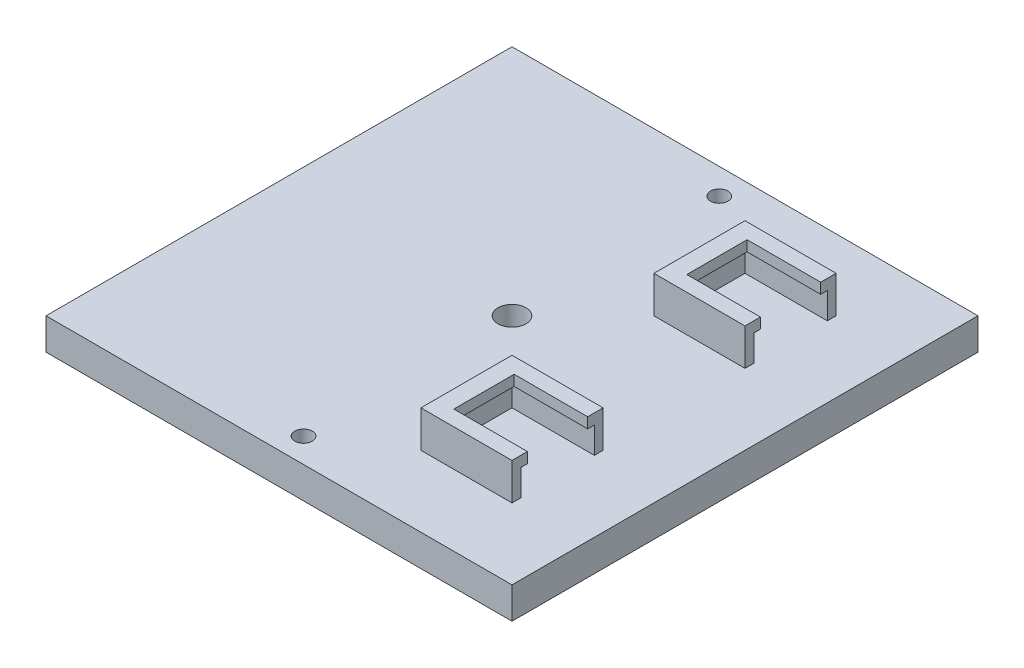
ISO-10303-21;
HEADER;
FILE_DESCRIPTION(('STEP AP214'),'2;1');
FILE_NAME('part.step','',(''),(''),'','','');
FILE_SCHEMA(('AUTOMOTIVE_DESIGN { 1 0 10303 214 1 1 1 1 }'));
ENDSEC;
DATA;
#1=APPLICATION_CONTEXT('core data for automotive mechanical design processes');
#2=APPLICATION_PROTOCOL_DEFINITION('international standard','automotive_design',2000,#1);
#3=PRODUCT_CONTEXT('',#1,'mechanical');
#4=PRODUCT('Part','Part','',(#3));
#5=PRODUCT_RELATED_PRODUCT_CATEGORY('part','',(#4));
#6=PRODUCT_DEFINITION_FORMATION('','',#4);
#7=PRODUCT_DEFINITION_CONTEXT('part definition',#1,'design');
#8=PRODUCT_DEFINITION('design','',#6,#7);
#9=PRODUCT_DEFINITION_SHAPE('','',#8);
#10=(LENGTH_UNIT() NAMED_UNIT(*) SI_UNIT(.MILLI.,.METRE.));
#11=(NAMED_UNIT(*) PLANE_ANGLE_UNIT() SI_UNIT($,.RADIAN.));
#12=(NAMED_UNIT(*) SI_UNIT($,.STERADIAN.) SOLID_ANGLE_UNIT());
#13=UNCERTAINTY_MEASURE_WITH_UNIT(LENGTH_MEASURE(1.E-05),#10,'distance_accuracy_value','');
#14=(GEOMETRIC_REPRESENTATION_CONTEXT(3) GLOBAL_UNCERTAINTY_ASSIGNED_CONTEXT((#13)) GLOBAL_UNIT_ASSIGNED_CONTEXT((#10,
#11,#12)) REPRESENTATION_CONTEXT('',''));
#15=CARTESIAN_POINT('',(0.,0.,0.));
#16=DIRECTION('',(0.,0.,1.));
#17=DIRECTION('',(1.,0.,0.));
#18=AXIS2_PLACEMENT_3D('',#15,#16,#17);
#19=CARTESIAN_POINT('',(-66.5,136.,66.5));
#20=DIRECTION('',(0.,0.,-1.));
#21=DIRECTION('',(-1.,0.,0.));
#22=AXIS2_PLACEMENT_3D('',#19,#20,#21);
#23=PLANE('',#22);
#24=DIRECTION('',(1.,0.,0.));
#25=VECTOR('',#24,1.);
#26=CARTESIAN_POINT('',(-66.5,0.,66.5));
#27=LINE('',#26,#25);
#28=CARTESIAN_POINT('',(-66.5,0.,66.5));
#29=VERTEX_POINT('',#28);
#30=CARTESIAN_POINT('',(66.5,0.,66.5));
#31=VERTEX_POINT('',#30);
#32=EDGE_CURVE('E280',#29,#31,#27,.T.);
#33=ORIENTED_EDGE('',*,*,#32,.T.);
#34=DIRECTION('',(0.,-1.,0.));
#35=VECTOR('',#34,1.);
#36=CARTESIAN_POINT('',(66.5,136.,66.5));
#37=LINE('',#36,#35);
#38=CARTESIAN_POINT('',(66.5,9.,66.5));
#39=VERTEX_POINT('',#38);
#40=EDGE_CURVE('E278',#39,#31,#37,.T.);
#41=ORIENTED_EDGE('',*,*,#40,.F.);
#42=DIRECTION('',(1.,0.,0.));
#43=VECTOR('',#42,1.);
#44=CARTESIAN_POINT('',(0.,9.,66.5));
#45=LINE('',#44,#43);
#46=CARTESIAN_POINT('',(-66.5,9.00000000000001,66.5));
#47=VERTEX_POINT('',#46);
#48=EDGE_CURVE('E283',#47,#39,#45,.T.);
#49=ORIENTED_EDGE('',*,*,#48,.F.);
#50=DIRECTION('',(0.,-1.,0.));
#51=VECTOR('',#50,1.);
#52=CARTESIAN_POINT('',(-66.5,136.,66.5));
#53=LINE('',#52,#51);
#54=EDGE_CURVE('E846',#47,#29,#53,.T.);
#55=ORIENTED_EDGE('',*,*,#54,.T.);
#56=EDGE_LOOP('',(#33,#41,#49,#55));
#57=FACE_BOUND('',#56,.T.);
#58=ADVANCED_FACE('F35',(#57),#23,.F.);
#59=CARTESIAN_POINT('',(-66.5,136.,-66.5));
#60=DIRECTION('',(0.,0.,1.));
#61=DIRECTION('',(1.,0.,0.));
#62=AXIS2_PLACEMENT_3D('',#59,#60,#61);
#63=PLANE('',#62);
#64=DIRECTION('',(-1.,0.,0.));
#65=VECTOR('',#64,1.);
#66=CARTESIAN_POINT('',(-66.5,0.,-66.5));
#67=LINE('',#66,#65);
#68=CARTESIAN_POINT('',(66.5,0.,-66.5));
#69=VERTEX_POINT('',#68);
#70=CARTESIAN_POINT('',(-66.5,0.,-66.5));
#71=VERTEX_POINT('',#70);
#72=EDGE_CURVE('E257',#69,#71,#67,.T.);
#73=ORIENTED_EDGE('',*,*,#72,.T.);
#74=DIRECTION('',(0.,-1.,0.));
#75=VECTOR('',#74,1.);
#76=CARTESIAN_POINT('',(-66.5,136.,-66.5));
#77=LINE('',#76,#75);
#78=CARTESIAN_POINT('',(-66.5,9.,-66.5));
#79=VERTEX_POINT('',#78);
#80=EDGE_CURVE('E302',#79,#71,#77,.T.);
#81=ORIENTED_EDGE('',*,*,#80,.F.);
#82=DIRECTION('',(1.,0.,0.));
#83=VECTOR('',#82,1.);
#84=CARTESIAN_POINT('',(-66.5,9.00000000000001,-66.5));
#85=LINE('',#84,#83);
#86=CARTESIAN_POINT('',(66.5,9.,-66.5));
#87=VERTEX_POINT('',#86);
#88=EDGE_CURVE('E268',#79,#87,#85,.T.);
#89=ORIENTED_EDGE('',*,*,#88,.T.);
#90=DIRECTION('',(0.,-1.,0.));
#91=VECTOR('',#90,1.);
#92=CARTESIAN_POINT('',(66.5,136.,-66.5));
#93=LINE('',#92,#91);
#94=EDGE_CURVE('E262',#87,#69,#93,.T.);
#95=ORIENTED_EDGE('',*,*,#94,.T.);
#96=EDGE_LOOP('',(#73,#81,#89,#95));
#97=FACE_BOUND('',#96,.T.);
#98=ADVANCED_FACE('F466',(#97),#63,.F.);
#99=CARTESIAN_POINT('',(0.,0.,0.));
#100=DIRECTION('',(0.,-1.,0.));
#101=DIRECTION('',(0.,0.,-1.));
#102=AXIS2_PLACEMENT_3D('',#99,#100,#101);
#103=PLANE('',#102);
#104=CARTESIAN_POINT('',(0.,0.,0.));
#105=DIRECTION('',(0.,-1.,0.));
#106=DIRECTION('',(0.,0.,-1.));
#107=AXIS2_PLACEMENT_3D('',#104,#105,#106);
#108=CIRCLE('',#107,4.);
#109=CARTESIAN_POINT('',(0.,0.,-4.));
#110=VERTEX_POINT('',#109);
#111=EDGE_CURVE('E831',#110,#110,#108,.T.);
#112=ORIENTED_EDGE('',*,*,#111,.F.);
#113=EDGE_LOOP('',(#112));
#114=FACE_BOUND('',#113,.T.);
#115=DIRECTION('',(0.,0.,-1.));
#116=VECTOR('',#115,1.);
#117=CARTESIAN_POINT('',(66.5,0.,66.5));
#118=LINE('',#117,#116);
#119=EDGE_CURVE('E274',#31,#69,#118,.T.);
#120=ORIENTED_EDGE('',*,*,#119,.F.);
#121=ORIENTED_EDGE('',*,*,#32,.F.);
#122=DIRECTION('',(0.,0.,1.));
#123=VECTOR('',#122,1.);
#124=CARTESIAN_POINT('',(-66.5,0.,66.5));
#125=LINE('',#124,#123);
#126=EDGE_CURVE('E272',#71,#29,#125,.T.);
#127=ORIENTED_EDGE('',*,*,#126,.F.);
#128=ORIENTED_EDGE('',*,*,#72,.F.);
#129=EDGE_LOOP('',(#120,#121,#127,#128));
#130=FACE_BOUND('',#129,.T.);
#131=CARTESIAN_POINT('',(0.,0.,-59.1597976431427));
#132=DIRECTION('',(0.,1.,0.));
#133=DIRECTION('',(0.,0.,1.));
#134=AXIS2_PLACEMENT_3D('',#131,#132,#133);
#135=CIRCLE('',#134,2.5);
#136=CARTESIAN_POINT('',(0.,0.,-56.6597976431427));
#137=VERTEX_POINT('',#136);
#138=EDGE_CURVE('E39',#137,#137,#135,.F.);
#139=ORIENTED_EDGE('',*,*,#138,.F.);
#140=EDGE_LOOP('',(#139));
#141=FACE_BOUND('',#140,.T.);
#142=CARTESIAN_POINT('',(0.,0.,59.4994711224337));
#143=DIRECTION('',(0.,1.,0.));
#144=DIRECTION('',(0.,0.,1.));
#145=AXIS2_PLACEMENT_3D('',#142,#143,#144);
#146=CIRCLE('',#145,2.5);
#147=CARTESIAN_POINT('',(0.,0.,61.9994711224337));
#148=VERTEX_POINT('',#147);
#149=EDGE_CURVE('E838',#148,#148,#146,.F.);
#150=ORIENTED_EDGE('',*,*,#149,.F.);
#151=EDGE_LOOP('',(#150));
#152=FACE_BOUND('',#151,.T.);
#153=ADVANCED_FACE('F473',(#114,#130,#141,#152),#103,.T.);
#154=CARTESIAN_POINT('',(46.25,19.5,0.));
#155=DIRECTION('',(1.,0.,0.));
#156=DIRECTION('',(0.,0.,-1.));
#157=AXIS2_PLACEMENT_3D('',#154,#155,#156);
#158=PLANE('',#157);
#159=DIRECTION('',(0.,1.,0.));
#160=VECTOR('',#159,1.);
#161=CARTESIAN_POINT('',(46.25,19.5,24.65));
#162=LINE('',#161,#160);
#163=CARTESIAN_POINT('',(46.25,16.5,24.65));
#164=VERTEX_POINT('',#163);
#165=CARTESIAN_POINT('',(46.25,19.5,24.65));
#166=VERTEX_POINT('',#165);
#167=EDGE_CURVE('E97',#164,#166,#162,.T.);
#168=ORIENTED_EDGE('',*,*,#167,.F.);
#169=DIRECTION('',(0.,0.,-1.));
#170=VECTOR('',#169,1.);
#171=CARTESIAN_POINT('',(46.25,16.5,43.75));
#172=LINE('',#171,#170);
#173=CARTESIAN_POINT('',(46.25,16.5,22.75));
#174=VERTEX_POINT('',#173);
#175=EDGE_CURVE('E249',#164,#174,#172,.T.);
#176=ORIENTED_EDGE('',*,*,#175,.T.);
#177=DIRECTION('',(0.,-1.,0.));
#178=VECTOR('',#177,1.);
#179=CARTESIAN_POINT('',(46.25,19.5,22.75));
#180=LINE('',#179,#178);
#181=CARTESIAN_POINT('',(46.25,9.,22.75));
#182=VERTEX_POINT('',#181);
#183=EDGE_CURVE('E256',#174,#182,#180,.T.);
#184=ORIENTED_EDGE('',*,*,#183,.T.);
#185=DIRECTION('',(0.,0.,1.));
#186=VECTOR('',#185,1.);
#187=CARTESIAN_POINT('',(46.25,9.,0.));
#188=LINE('',#187,#186);
#189=CARTESIAN_POINT('',(46.25,9.,20.25));
#190=VERTEX_POINT('',#189);
#191=EDGE_CURVE('E317',#190,#182,#188,.T.);
#192=ORIENTED_EDGE('',*,*,#191,.F.);
#193=DIRECTION('',(0.,-1.,0.));
#194=VECTOR('',#193,1.);
#195=CARTESIAN_POINT('',(46.25,19.5,20.25));
#196=LINE('',#195,#194);
#197=CARTESIAN_POINT('',(46.25,19.5,20.25));
#198=VERTEX_POINT('',#197);
#199=EDGE_CURVE('E250',#198,#190,#196,.T.);
#200=ORIENTED_EDGE('',*,*,#199,.F.);
#201=DIRECTION('',(0.,0.,1.));
#202=VECTOR('',#201,1.);
#203=CARTESIAN_POINT('',(46.25,19.5,0.));
#204=LINE('',#203,#202);
#205=EDGE_CURVE('E260',#198,#166,#204,.T.);
#206=ORIENTED_EDGE('',*,*,#205,.T.);
#207=EDGE_LOOP('',(#168,#176,#184,#192,#200,#206));
#208=FACE_BOUND('',#207,.T.);
#209=ADVANCED_FACE('F427',(#208),#158,.T.);
#210=CARTESIAN_POINT('',(46.25,19.5,0.));
#211=DIRECTION('',(-1.,0.,0.));
#212=DIRECTION('',(0.,0.,1.));
#213=AXIS2_PLACEMENT_3D('',#210,#211,#212);
#214=PLANE('',#213);
#215=DIRECTION('',(0.,0.,-1.));
#216=VECTOR('',#215,1.);
#217=CARTESIAN_POINT('',(46.25,19.5,0.));
#218=LINE('',#217,#216);
#219=CARTESIAN_POINT('',(46.25,19.5,-41.85));
#220=VERTEX_POINT('',#219);
#221=CARTESIAN_POINT('',(46.25,19.5,-46.25));
#222=VERTEX_POINT('',#221);
#223=EDGE_CURVE('E348',#220,#222,#218,.T.);
#224=ORIENTED_EDGE('',*,*,#223,.F.);
#225=DIRECTION('',(0.,-1.,0.));
#226=VECTOR('',#225,1.);
#227=CARTESIAN_POINT('',(46.25,19.5,-41.85));
#228=LINE('',#227,#226);
#229=CARTESIAN_POINT('',(46.25,16.5,-41.85));
#230=VERTEX_POINT('',#229);
#231=EDGE_CURVE('E331',#220,#230,#228,.T.);
#232=ORIENTED_EDGE('',*,*,#231,.T.);
#233=DIRECTION('',(0.,0.,-1.));
#234=VECTOR('',#233,1.);
#235=CARTESIAN_POINT('',(46.25,16.5,-22.75));
#236=LINE('',#235,#234);
#237=CARTESIAN_POINT('',(46.25,16.5,-43.75));
#238=VERTEX_POINT('',#237);
#239=EDGE_CURVE('E335',#230,#238,#236,.T.);
#240=ORIENTED_EDGE('',*,*,#239,.T.);
#241=DIRECTION('',(0.,-1.,0.));
#242=VECTOR('',#241,1.);
#243=CARTESIAN_POINT('',(46.25,19.5,-43.75));
#244=LINE('',#243,#242);
#245=CARTESIAN_POINT('',(46.25,9.,-43.75));
#246=VERTEX_POINT('',#245);
#247=EDGE_CURVE('E332',#238,#246,#244,.T.);
#248=ORIENTED_EDGE('',*,*,#247,.T.);
#249=DIRECTION('',(0.,0.,-1.));
#250=VECTOR('',#249,1.);
#251=CARTESIAN_POINT('',(46.25,9.,0.));
#252=LINE('',#251,#250);
#253=CARTESIAN_POINT('',(46.25,9.,-46.25));
#254=VERTEX_POINT('',#253);
#255=EDGE_CURVE('E334',#246,#254,#252,.T.);
#256=ORIENTED_EDGE('',*,*,#255,.T.);
#257=DIRECTION('',(0.,-1.,0.));
#258=VECTOR('',#257,1.);
#259=CARTESIAN_POINT('',(46.25,19.5,-46.25));
#260=LINE('',#259,#258);
#261=EDGE_CURVE('E336',#222,#254,#260,.T.);
#262=ORIENTED_EDGE('',*,*,#261,.F.);
#263=EDGE_LOOP('',(#224,#232,#240,#248,#256,#262));
#264=FACE_BOUND('',#263,.T.);
#265=ADVANCED_FACE('F513',(#264),#214,.F.);
#266=CARTESIAN_POINT('',(0.,19.5,-43.75));
#267=DIRECTION('',(0.,0.,1.));
#268=DIRECTION('',(1.,0.,0.));
#269=AXIS2_PLACEMENT_3D('',#266,#267,#268);
#270=PLANE('',#269);
#271=ORIENTED_EDGE('',*,*,#247,.F.);
#272=DIRECTION('',(-1.,0.,0.));
#273=VECTOR('',#272,1.);
#274=CARTESIAN_POINT('',(67.4632034355964,16.5,-43.75));
#275=LINE('',#274,#273);
#276=CARTESIAN_POINT('',(22.75,16.5,-43.75));
#277=VERTEX_POINT('',#276);
#278=EDGE_CURVE('E361',#238,#277,#275,.T.);
#279=ORIENTED_EDGE('',*,*,#278,.T.);
#280=DIRECTION('',(0.,-1.,0.));
#281=VECTOR('',#280,1.);
#282=CARTESIAN_POINT('',(22.75,19.5,-43.75));
#283=LINE('',#282,#281);
#284=CARTESIAN_POINT('',(22.75,9.,-43.75));
#285=VERTEX_POINT('',#284);
#286=EDGE_CURVE('E357',#277,#285,#283,.T.);
#287=ORIENTED_EDGE('',*,*,#286,.T.);
#288=DIRECTION('',(-1.,0.,0.));
#289=VECTOR('',#288,1.);
#290=CARTESIAN_POINT('',(0.,9.,-43.75));
#291=LINE('',#290,#289);
#292=EDGE_CURVE('E277',#246,#285,#291,.T.);
#293=ORIENTED_EDGE('',*,*,#292,.F.);
#294=EDGE_LOOP('',(#271,#279,#287,#293));
#295=FACE_BOUND('',#294,.T.);
#296=ADVANCED_FACE('F509',(#295),#270,.T.);
#297=CARTESIAN_POINT('',(0.,19.5,-22.75));
#298=DIRECTION('',(0.,0.,-1.));
#299=DIRECTION('',(-1.,0.,0.));
#300=AXIS2_PLACEMENT_3D('',#297,#298,#299);
#301=PLANE('',#300);
#302=DIRECTION('',(0.,-1.,0.));
#303=VECTOR('',#302,1.);
#304=CARTESIAN_POINT('',(22.75,19.5,-22.75));
#305=LINE('',#304,#303);
#306=CARTESIAN_POINT('',(22.75,16.5,-22.75));
#307=VERTEX_POINT('',#306);
#308=CARTESIAN_POINT('',(22.75,9.,-22.75));
#309=VERTEX_POINT('',#308);
#310=EDGE_CURVE('E356',#307,#309,#305,.T.);
#311=ORIENTED_EDGE('',*,*,#310,.F.);
#312=DIRECTION('',(-1.,0.,0.));
#313=VECTOR('',#312,1.);
#314=CARTESIAN_POINT('',(67.4632034355964,16.5,-22.75));
#315=LINE('',#314,#313);
#316=CARTESIAN_POINT('',(46.25,16.5,-22.75));
#317=VERTEX_POINT('',#316);
#318=EDGE_CURVE('E389',#317,#307,#315,.T.);
#319=ORIENTED_EDGE('',*,*,#318,.F.);
#320=DIRECTION('',(0.,-1.,0.));
#321=VECTOR('',#320,1.);
#322=CARTESIAN_POINT('',(46.25,19.5,-22.75));
#323=LINE('',#322,#321);
#324=CARTESIAN_POINT('',(46.25,9.,-22.75));
#325=VERTEX_POINT('',#324);
#326=EDGE_CURVE('E354',#317,#325,#323,.T.);
#327=ORIENTED_EDGE('',*,*,#326,.T.);
#328=DIRECTION('',(1.,0.,0.));
#329=VECTOR('',#328,1.);
#330=CARTESIAN_POINT('',(0.,9.,-22.75));
#331=LINE('',#330,#329);
#332=EDGE_CURVE('E364',#309,#325,#331,.T.);
#333=ORIENTED_EDGE('',*,*,#332,.F.);
#334=EDGE_LOOP('',(#311,#319,#327,#333));
#335=FACE_BOUND('',#334,.T.);
#336=ADVANCED_FACE('F512',(#335),#301,.T.);
#337=CARTESIAN_POINT('',(22.75,19.5,0.));
#338=DIRECTION('',(-1.,0.,0.));
#339=DIRECTION('',(0.,0.,1.));
#340=AXIS2_PLACEMENT_3D('',#337,#338,#339);
#341=PLANE('',#340);
#342=DIRECTION('',(0.,0.,-1.));
#343=VECTOR('',#342,1.);
#344=CARTESIAN_POINT('',(22.75,16.5,-22.75));
#345=LINE('',#344,#343);
#346=EDGE_CURVE('E395',#307,#277,#345,.T.);
#347=ORIENTED_EDGE('',*,*,#346,.F.);
#348=ORIENTED_EDGE('',*,*,#310,.T.);
#349=DIRECTION('',(0.,0.,-1.));
#350=VECTOR('',#349,1.);
#351=CARTESIAN_POINT('',(22.75,9.,0.));
#352=LINE('',#351,#350);
#353=EDGE_CURVE('E359',#309,#285,#352,.T.);
#354=ORIENTED_EDGE('',*,*,#353,.T.);
#355=ORIENTED_EDGE('',*,*,#286,.F.);
#356=EDGE_LOOP('',(#347,#348,#354,#355));
#357=FACE_BOUND('',#356,.T.);
#358=ADVANCED_FACE('F488',(#357),#341,.F.);
#359=CARTESIAN_POINT('',(0.,19.5,22.75));
#360=DIRECTION('',(0.,0.,1.));
#361=DIRECTION('',(1.,0.,0.));
#362=AXIS2_PLACEMENT_3D('',#359,#360,#361);
#363=PLANE('',#362);
#364=ORIENTED_EDGE('',*,*,#183,.F.);
#365=DIRECTION('',(-1.,0.,0.));
#366=VECTOR('',#365,1.);
#367=CARTESIAN_POINT('',(67.4632034355964,16.5,22.75));
#368=LINE('',#367,#366);
#369=CARTESIAN_POINT('',(22.75,16.5,22.75));
#370=VERTEX_POINT('',#369);
#371=EDGE_CURVE('E304',#174,#370,#368,.T.);
#372=ORIENTED_EDGE('',*,*,#371,.T.);
#373=DIRECTION('',(0.,-1.,0.));
#374=VECTOR('',#373,1.);
#375=CARTESIAN_POINT('',(22.75,19.5,22.75));
#376=LINE('',#375,#374);
#377=CARTESIAN_POINT('',(22.75,9.,22.75));
#378=VERTEX_POINT('',#377);
#379=EDGE_CURVE('E300',#370,#378,#376,.T.);
#380=ORIENTED_EDGE('',*,*,#379,.T.);
#381=DIRECTION('',(-1.,0.,0.));
#382=VECTOR('',#381,1.);
#383=CARTESIAN_POINT('',(0.,9.,22.75));
#384=LINE('',#383,#382);
#385=EDGE_CURVE('E309',#182,#378,#384,.T.);
#386=ORIENTED_EDGE('',*,*,#385,.F.);
#387=EDGE_LOOP('',(#364,#372,#380,#386));
#388=FACE_BOUND('',#387,.T.);
#389=ADVANCED_FACE('F431',(#388),#363,.T.);
#390=CARTESIAN_POINT('',(0.,19.5,43.75));
#391=DIRECTION('',(0.,0.,-1.));
#392=DIRECTION('',(-1.,0.,0.));
#393=AXIS2_PLACEMENT_3D('',#390,#391,#392);
#394=PLANE('',#393);
#395=DIRECTION('',(0.,-1.,0.));
#396=VECTOR('',#395,1.);
#397=CARTESIAN_POINT('',(22.75,19.5,43.75));
#398=LINE('',#397,#396);
#399=CARTESIAN_POINT('',(22.75,16.5,43.75));
#400=VERTEX_POINT('',#399);
#401=CARTESIAN_POINT('',(22.75,9.,43.75));
#402=VERTEX_POINT('',#401);
#403=EDGE_CURVE('E299',#400,#402,#398,.T.);
#404=ORIENTED_EDGE('',*,*,#403,.F.);
#405=DIRECTION('',(-1.,0.,0.));
#406=VECTOR('',#405,1.);
#407=CARTESIAN_POINT('',(67.4632034355964,16.5,43.75));
#408=LINE('',#407,#406);
#409=CARTESIAN_POINT('',(46.25,16.5,43.75));
#410=VERTEX_POINT('',#409);
#411=EDGE_CURVE('E239',#410,#400,#408,.T.);
#412=ORIENTED_EDGE('',*,*,#411,.F.);
#413=DIRECTION('',(0.,-1.,0.));
#414=VECTOR('',#413,1.);
#415=CARTESIAN_POINT('',(46.25,19.5,43.75));
#416=LINE('',#415,#414);
#417=CARTESIAN_POINT('',(46.25,9.,43.75));
#418=VERTEX_POINT('',#417);
#419=EDGE_CURVE('E245',#410,#418,#416,.T.);
#420=ORIENTED_EDGE('',*,*,#419,.T.);
#421=DIRECTION('',(1.,0.,0.));
#422=VECTOR('',#421,1.);
#423=CARTESIAN_POINT('',(0.,9.,43.75));
#424=LINE('',#423,#422);
#425=EDGE_CURVE('E308',#402,#418,#424,.T.);
#426=ORIENTED_EDGE('',*,*,#425,.F.);
#427=EDGE_LOOP('',(#404,#412,#420,#426));
#428=FACE_BOUND('',#427,.T.);
#429=ADVANCED_FACE('F487',(#428),#394,.T.);
#430=CARTESIAN_POINT('',(22.75,19.5,0.));
#431=DIRECTION('',(1.,0.,0.));
#432=DIRECTION('',(0.,0.,-1.));
#433=AXIS2_PLACEMENT_3D('',#430,#431,#432);
#434=PLANE('',#433);
#435=ORIENTED_EDGE('',*,*,#379,.F.);
#436=DIRECTION('',(0.,0.,-1.));
#437=VECTOR('',#436,1.);
#438=CARTESIAN_POINT('',(22.75,16.5,43.75));
#439=LINE('',#438,#437);
#440=EDGE_CURVE('E384',#400,#370,#439,.T.);
#441=ORIENTED_EDGE('',*,*,#440,.F.);
#442=ORIENTED_EDGE('',*,*,#403,.T.);
#443=DIRECTION('',(0.,0.,1.));
#444=VECTOR('',#443,1.);
#445=CARTESIAN_POINT('',(22.75,9.,0.));
#446=LINE('',#445,#444);
#447=EDGE_CURVE('E305',#378,#402,#446,.T.);
#448=ORIENTED_EDGE('',*,*,#447,.F.);
#449=EDGE_LOOP('',(#435,#441,#442,#448));
#450=FACE_BOUND('',#449,.T.);
#451=ADVANCED_FACE('F435',(#450),#434,.T.);
#452=CARTESIAN_POINT('',(-66.5,136.,66.5));
#453=DIRECTION('',(1.,0.,0.));
#454=DIRECTION('',(0.,0.,-1.));
#455=AXIS2_PLACEMENT_3D('',#452,#453,#454);
#456=PLANE('',#455);
#457=ORIENTED_EDGE('',*,*,#54,.F.);
#458=DIRECTION('',(0.,0.,1.));
#459=VECTOR('',#458,1.);
#460=CARTESIAN_POINT('',(-66.5,9.,-69.5));
#461=LINE('',#460,#459);
#462=EDGE_CURVE('E281',#79,#47,#461,.T.);
#463=ORIENTED_EDGE('',*,*,#462,.F.);
#464=ORIENTED_EDGE('',*,*,#80,.T.);
#465=ORIENTED_EDGE('',*,*,#126,.T.);
#466=EDGE_LOOP('',(#457,#463,#464,#465));
#467=FACE_BOUND('',#466,.T.);
#468=ADVANCED_FACE('F477',(#467),#456,.F.);
#469=CARTESIAN_POINT('',(66.5,136.,66.5));
#470=DIRECTION('',(-1.,0.,0.));
#471=DIRECTION('',(0.,0.,1.));
#472=AXIS2_PLACEMENT_3D('',#469,#470,#471);
#473=PLANE('',#472);
#474=ORIENTED_EDGE('',*,*,#94,.F.);
#475=DIRECTION('',(0.,0.,1.));
#476=VECTOR('',#475,1.);
#477=CARTESIAN_POINT('',(66.5,9.,-69.5));
#478=LINE('',#477,#476);
#479=EDGE_CURVE('E285',#87,#39,#478,.T.);
#480=ORIENTED_EDGE('',*,*,#479,.T.);
#481=ORIENTED_EDGE('',*,*,#40,.T.);
#482=ORIENTED_EDGE('',*,*,#119,.T.);
#483=EDGE_LOOP('',(#474,#480,#481,#482));
#484=FACE_BOUND('',#483,.T.);
#485=ADVANCED_FACE('F483',(#484),#473,.F.);
#486=CARTESIAN_POINT('',(0.,9.,-69.5));
#487=DIRECTION('',(0.,-1.,0.));
#488=DIRECTION('',(0.,0.,-1.));
#489=AXIS2_PLACEMENT_3D('',#486,#487,#488);
#490=PLANE('',#489);
#491=CARTESIAN_POINT('',(0.,9.,0.));
#492=DIRECTION('',(0.,1.,0.));
#493=DIRECTION('',(0.,0.,1.));
#494=AXIS2_PLACEMENT_3D('',#491,#492,#493);
#495=CIRCLE('',#494,4.);
#496=CARTESIAN_POINT('',(0.,9.,4.));
#497=VERTEX_POINT('',#496);
#498=EDGE_CURVE('E834',#497,#497,#495,.T.);
#499=ORIENTED_EDGE('',*,*,#498,.F.);
#500=EDGE_LOOP('',(#499));
#501=FACE_BOUND('',#500,.T.);
#502=CARTESIAN_POINT('',(0.,8.99999999999999,-59.1597976431427));
#503=DIRECTION('',(0.,-1.,0.));
#504=DIRECTION('',(0.,0.,-1.));
#505=AXIS2_PLACEMENT_3D('',#502,#503,#504);
#506=CIRCLE('',#505,2.5);
#507=CARTESIAN_POINT('',(0.,8.99999999999999,-61.6597976431427));
#508=VERTEX_POINT('',#507);
#509=EDGE_CURVE('E841',#508,#508,#506,.T.);
#510=ORIENTED_EDGE('',*,*,#509,.T.);
#511=EDGE_LOOP('',(#510));
#512=FACE_BOUND('',#511,.T.);
#513=CARTESIAN_POINT('',(0.,8.99999999999999,59.4994711224337));
#514=DIRECTION('',(0.,-1.,0.));
#515=DIRECTION('',(0.,0.,-1.));
#516=AXIS2_PLACEMENT_3D('',#513,#514,#515);
#517=CIRCLE('',#516,2.5);
#518=CARTESIAN_POINT('',(0.,8.99999999999999,56.9994711224337));
#519=VERTEX_POINT('',#518);
#520=EDGE_CURVE('E844',#519,#519,#517,.T.);
#521=ORIENTED_EDGE('',*,*,#520,.T.);
#522=EDGE_LOOP('',(#521));
#523=FACE_BOUND('',#522,.T.);
#524=ORIENTED_EDGE('',*,*,#255,.F.);
#525=ORIENTED_EDGE('',*,*,#292,.T.);
#526=ORIENTED_EDGE('',*,*,#353,.F.);
#527=ORIENTED_EDGE('',*,*,#332,.T.);
#528=CARTESIAN_POINT('',(46.25,9.,-20.25));
#529=VERTEX_POINT('',#528);
#530=EDGE_CURVE('E352',#529,#325,#252,.T.);
#531=ORIENTED_EDGE('',*,*,#530,.F.);
#532=DIRECTION('',(-1.,0.,0.));
#533=VECTOR('',#532,1.);
#534=CARTESIAN_POINT('',(0.,9.,-20.25));
#535=LINE('',#534,#533);
#536=CARTESIAN_POINT('',(20.25,9.,-20.25));
#537=VERTEX_POINT('',#536);
#538=EDGE_CURVE('E367',#529,#537,#535,.T.);
#539=ORIENTED_EDGE('',*,*,#538,.T.);
#540=DIRECTION('',(0.,0.,-1.));
#541=VECTOR('',#540,1.);
#542=CARTESIAN_POINT('',(20.25,9.,0.));
#543=LINE('',#542,#541);
#544=CARTESIAN_POINT('',(20.25,9.,-46.25));
#545=VERTEX_POINT('',#544);
#546=EDGE_CURVE('E320',#537,#545,#543,.T.);
#547=ORIENTED_EDGE('',*,*,#546,.T.);
#548=DIRECTION('',(-1.,0.,0.));
#549=VECTOR('',#548,1.);
#550=CARTESIAN_POINT('',(0.,9.,-46.25));
#551=LINE('',#550,#549);
#552=EDGE_CURVE('E340',#254,#545,#551,.T.);
#553=ORIENTED_EDGE('',*,*,#552,.F.);
#554=EDGE_LOOP('',(#524,#525,#526,#527,#531,#539,#547,#553));
#555=FACE_BOUND('',#554,.T.);
#556=ORIENTED_EDGE('',*,*,#191,.T.);
#557=ORIENTED_EDGE('',*,*,#385,.T.);
#558=ORIENTED_EDGE('',*,*,#447,.T.);
#559=ORIENTED_EDGE('',*,*,#425,.T.);
#560=CARTESIAN_POINT('',(46.25,9.,46.25));
#561=VERTEX_POINT('',#560);
#562=EDGE_CURVE('E312',#418,#561,#188,.T.);
#563=ORIENTED_EDGE('',*,*,#562,.T.);
#564=DIRECTION('',(-1.,0.,0.));
#565=VECTOR('',#564,1.);
#566=CARTESIAN_POINT('',(0.,9.,46.25));
#567=LINE('',#566,#565);
#568=CARTESIAN_POINT('',(20.25,9.,46.25));
#569=VERTEX_POINT('',#568);
#570=EDGE_CURVE('E284',#561,#569,#567,.T.);
#571=ORIENTED_EDGE('',*,*,#570,.T.);
#572=DIRECTION('',(0.,0.,1.));
#573=VECTOR('',#572,1.);
#574=CARTESIAN_POINT('',(20.25,9.,0.));
#575=LINE('',#574,#573);
#576=CARTESIAN_POINT('',(20.25,9.,20.25));
#577=VERTEX_POINT('',#576);
#578=EDGE_CURVE('E290',#577,#569,#575,.T.);
#579=ORIENTED_EDGE('',*,*,#578,.F.);
#580=DIRECTION('',(-1.,0.,0.));
#581=VECTOR('',#580,1.);
#582=CARTESIAN_POINT('',(0.,9.,20.25));
#583=LINE('',#582,#581);
#584=EDGE_CURVE('E246',#190,#577,#583,.T.);
#585=ORIENTED_EDGE('',*,*,#584,.F.);
#586=EDGE_LOOP('',(#556,#557,#558,#559,#563,#571,#579,#585));
#587=FACE_BOUND('',#586,.T.);
#588=ORIENTED_EDGE('',*,*,#462,.T.);
#589=ORIENTED_EDGE('',*,*,#48,.T.);
#590=ORIENTED_EDGE('',*,*,#479,.F.);
#591=ORIENTED_EDGE('',*,*,#88,.F.);
#592=EDGE_LOOP('',(#588,#589,#590,#591));
#593=FACE_BOUND('',#592,.T.);
#594=ADVANCED_FACE('F439',(#501,#512,#523,#555,#587,#593),#490,.F.);
#595=DIRECTION('',(0.,-1.,0.));
#596=VECTOR('',#595,1.);
#597=CARTESIAN_POINT('',(46.25,19.5,41.85));
#598=LINE('',#597,#596);
#599=CARTESIAN_POINT('',(46.25,19.5,41.85));
#600=VERTEX_POINT('',#599);
#601=CARTESIAN_POINT('',(46.25,16.5,41.85));
#602=VERTEX_POINT('',#601);
#603=EDGE_CURVE('E220',#600,#602,#598,.T.);
#604=ORIENTED_EDGE('',*,*,#603,.F.);
#605=CARTESIAN_POINT('',(46.25,19.5,46.25));
#606=VERTEX_POINT('',#605);
#607=EDGE_CURVE('E252',#600,#606,#204,.T.);
#608=ORIENTED_EDGE('',*,*,#607,.T.);
#609=DIRECTION('',(0.,-1.,0.));
#610=VECTOR('',#609,1.);
#611=CARTESIAN_POINT('',(46.25,19.5,46.25));
#612=LINE('',#611,#610);
#613=EDGE_CURVE('E247',#606,#561,#612,.T.);
#614=ORIENTED_EDGE('',*,*,#613,.T.);
#615=ORIENTED_EDGE('',*,*,#562,.F.);
#616=ORIENTED_EDGE('',*,*,#419,.F.);
#617=EDGE_CURVE('E236',#410,#602,#172,.T.);
#618=ORIENTED_EDGE('',*,*,#617,.T.);
#619=EDGE_LOOP('',(#604,#608,#614,#615,#616,#618));
#620=FACE_BOUND('',#619,.T.);
#621=ADVANCED_FACE('F243',(#620),#158,.T.);
#622=CARTESIAN_POINT('',(0.,19.5,20.25));
#623=DIRECTION('',(0.,0.,1.));
#624=DIRECTION('',(1.,0.,0.));
#625=AXIS2_PLACEMENT_3D('',#622,#623,#624);
#626=PLANE('',#625);
#627=ORIENTED_EDGE('',*,*,#584,.T.);
#628=DIRECTION('',(0.,-1.,0.));
#629=VECTOR('',#628,1.);
#630=CARTESIAN_POINT('',(20.25,19.5,20.25));
#631=LINE('',#630,#629);
#632=CARTESIAN_POINT('',(20.25,19.5,20.25));
#633=VERTEX_POINT('',#632);
#634=EDGE_CURVE('E291',#633,#577,#631,.T.);
#635=ORIENTED_EDGE('',*,*,#634,.F.);
#636=DIRECTION('',(-1.,0.,0.));
#637=VECTOR('',#636,1.);
#638=CARTESIAN_POINT('',(0.,19.5,20.25));
#639=LINE('',#638,#637);
#640=EDGE_CURVE('E296',#198,#633,#639,.T.);
#641=ORIENTED_EDGE('',*,*,#640,.F.);
#642=ORIENTED_EDGE('',*,*,#199,.T.);
#643=EDGE_LOOP('',(#627,#635,#641,#642));
#644=FACE_BOUND('',#643,.T.);
#645=ADVANCED_FACE('F447',(#644),#626,.F.);
#646=CARTESIAN_POINT('',(20.25,19.5,0.));
#647=DIRECTION('',(1.,0.,0.));
#648=DIRECTION('',(0.,0.,-1.));
#649=AXIS2_PLACEMENT_3D('',#646,#647,#648);
#650=PLANE('',#649);
#651=ORIENTED_EDGE('',*,*,#578,.T.);
#652=DIRECTION('',(0.,-1.,0.));
#653=VECTOR('',#652,1.);
#654=CARTESIAN_POINT('',(20.25,19.5,46.25));
#655=LINE('',#654,#653);
#656=CARTESIAN_POINT('',(20.25,19.5,46.25));
#657=VERTEX_POINT('',#656);
#658=EDGE_CURVE('E295',#657,#569,#655,.T.);
#659=ORIENTED_EDGE('',*,*,#658,.F.);
#660=DIRECTION('',(0.,0.,1.));
#661=VECTOR('',#660,1.);
#662=CARTESIAN_POINT('',(20.25,19.5,0.));
#663=LINE('',#662,#661);
#664=EDGE_CURVE('E325',#633,#657,#663,.T.);
#665=ORIENTED_EDGE('',*,*,#664,.F.);
#666=ORIENTED_EDGE('',*,*,#634,.T.);
#667=EDGE_LOOP('',(#651,#659,#665,#666));
#668=FACE_BOUND('',#667,.T.);
#669=ADVANCED_FACE('F491',(#668),#650,.F.);
#670=CARTESIAN_POINT('',(0.,19.5,46.25));
#671=DIRECTION('',(0.,0.,1.));
#672=DIRECTION('',(1.,0.,0.));
#673=AXIS2_PLACEMENT_3D('',#670,#671,#672);
#674=PLANE('',#673);
#675=ORIENTED_EDGE('',*,*,#570,.F.);
#676=ORIENTED_EDGE('',*,*,#613,.F.);
#677=DIRECTION('',(-1.,0.,0.));
#678=VECTOR('',#677,1.);
#679=CARTESIAN_POINT('',(0.,19.5,46.25));
#680=LINE('',#679,#678);
#681=EDGE_CURVE('E294',#606,#657,#680,.T.);
#682=ORIENTED_EDGE('',*,*,#681,.T.);
#683=ORIENTED_EDGE('',*,*,#658,.T.);
#684=EDGE_LOOP('',(#675,#676,#682,#683));
#685=FACE_BOUND('',#684,.T.);
#686=ADVANCED_FACE('F494',(#685),#674,.T.);
#687=CARTESIAN_POINT('',(0.,19.5,0.));
#688=DIRECTION('',(0.,1.,0.));
#689=DIRECTION('',(0.,0.,1.));
#690=AXIS2_PLACEMENT_3D('',#687,#688,#689);
#691=PLANE('',#690);
#692=DIRECTION('',(-1.,0.,0.));
#693=VECTOR('',#692,1.);
#694=CARTESIAN_POINT('',(67.25,19.5,24.65));
#695=LINE('',#694,#693);
#696=CARTESIAN_POINT('',(25.25,19.5,24.65));
#697=VERTEX_POINT('',#696);
#698=EDGE_CURVE('E93',#166,#697,#695,.T.);
#699=ORIENTED_EDGE('',*,*,#698,.F.);
#700=ORIENTED_EDGE('',*,*,#205,.F.);
#701=ORIENTED_EDGE('',*,*,#640,.T.);
#702=ORIENTED_EDGE('',*,*,#664,.T.);
#703=ORIENTED_EDGE('',*,*,#681,.F.);
#704=ORIENTED_EDGE('',*,*,#607,.F.);
#705=DIRECTION('',(1.,0.,0.));
#706=VECTOR('',#705,1.);
#707=CARTESIAN_POINT('',(67.25,19.5,41.85));
#708=LINE('',#707,#706);
#709=CARTESIAN_POINT('',(25.25,19.5,41.85));
#710=VERTEX_POINT('',#709);
#711=EDGE_CURVE('E11',#710,#600,#708,.T.);
#712=ORIENTED_EDGE('',*,*,#711,.F.);
#713=DIRECTION('',(0.,0.,1.));
#714=VECTOR('',#713,1.);
#715=CARTESIAN_POINT('',(25.25,19.5,41.85));
#716=LINE('',#715,#714);
#717=EDGE_CURVE('E400',#697,#710,#716,.T.);
#718=ORIENTED_EDGE('',*,*,#717,.F.);
#719=EDGE_LOOP('',(#699,#700,#701,#702,#703,#704,#712,#718));
#720=FACE_BOUND('',#719,.T.);
#721=ADVANCED_FACE('F450',(#720),#691,.T.);
#722=CARTESIAN_POINT('',(46.25,16.5,-24.65));
#723=VERTEX_POINT('',#722);
#724=EDGE_CURVE('E327',#317,#723,#236,.T.);
#725=ORIENTED_EDGE('',*,*,#724,.T.);
#726=DIRECTION('',(0.,1.,0.));
#727=VECTOR('',#726,1.);
#728=CARTESIAN_POINT('',(46.25,19.5,-24.65));
#729=LINE('',#728,#727);
#730=CARTESIAN_POINT('',(46.25,19.5,-24.65));
#731=VERTEX_POINT('',#730);
#732=EDGE_CURVE('E353',#723,#731,#729,.T.);
#733=ORIENTED_EDGE('',*,*,#732,.T.);
#734=CARTESIAN_POINT('',(46.25,19.5,-20.25));
#735=VERTEX_POINT('',#734);
#736=EDGE_CURVE('E240',#735,#731,#218,.T.);
#737=ORIENTED_EDGE('',*,*,#736,.F.);
#738=DIRECTION('',(0.,-1.,0.));
#739=VECTOR('',#738,1.);
#740=CARTESIAN_POINT('',(46.25,19.5,-20.25));
#741=LINE('',#740,#739);
#742=EDGE_CURVE('E349',#735,#529,#741,.T.);
#743=ORIENTED_EDGE('',*,*,#742,.T.);
#744=ORIENTED_EDGE('',*,*,#530,.T.);
#745=ORIENTED_EDGE('',*,*,#326,.F.);
#746=EDGE_LOOP('',(#725,#733,#737,#743,#744,#745));
#747=FACE_BOUND('',#746,.T.);
#748=ADVANCED_FACE('F508',(#747),#214,.F.);
#749=CARTESIAN_POINT('',(0.,19.5,-46.25));
#750=DIRECTION('',(0.,0.,1.));
#751=DIRECTION('',(1.,0.,0.));
#752=AXIS2_PLACEMENT_3D('',#749,#750,#751);
#753=PLANE('',#752);
#754=ORIENTED_EDGE('',*,*,#552,.T.);
#755=DIRECTION('',(0.,-1.,0.));
#756=VECTOR('',#755,1.);
#757=CARTESIAN_POINT('',(20.25,19.5,-46.25));
#758=LINE('',#757,#756);
#759=CARTESIAN_POINT('',(20.25,19.5,-46.25));
#760=VERTEX_POINT('',#759);
#761=EDGE_CURVE('E341',#760,#545,#758,.T.);
#762=ORIENTED_EDGE('',*,*,#761,.F.);
#763=DIRECTION('',(-1.,0.,0.));
#764=VECTOR('',#763,1.);
#765=CARTESIAN_POINT('',(0.,19.5,-46.25));
#766=LINE('',#765,#764);
#767=EDGE_CURVE('E380',#222,#760,#766,.T.);
#768=ORIENTED_EDGE('',*,*,#767,.F.);
#769=ORIENTED_EDGE('',*,*,#261,.T.);
#770=EDGE_LOOP('',(#754,#762,#768,#769));
#771=FACE_BOUND('',#770,.T.);
#772=ADVANCED_FACE('F515',(#771),#753,.F.);
#773=CARTESIAN_POINT('',(20.25,19.5,0.));
#774=DIRECTION('',(-1.,0.,0.));
#775=DIRECTION('',(0.,0.,1.));
#776=AXIS2_PLACEMENT_3D('',#773,#774,#775);
#777=PLANE('',#776);
#778=ORIENTED_EDGE('',*,*,#546,.F.);
#779=DIRECTION('',(0.,-1.,0.));
#780=VECTOR('',#779,1.);
#781=CARTESIAN_POINT('',(20.25,19.5,-20.25));
#782=LINE('',#781,#780);
#783=CARTESIAN_POINT('',(20.25,19.5,-20.25));
#784=VERTEX_POINT('',#783);
#785=EDGE_CURVE('E345',#784,#537,#782,.T.);
#786=ORIENTED_EDGE('',*,*,#785,.F.);
#787=DIRECTION('',(0.,0.,-1.));
#788=VECTOR('',#787,1.);
#789=CARTESIAN_POINT('',(20.25,19.5,0.));
#790=LINE('',#789,#788);
#791=EDGE_CURVE('E339',#784,#760,#790,.T.);
#792=ORIENTED_EDGE('',*,*,#791,.T.);
#793=ORIENTED_EDGE('',*,*,#761,.T.);
#794=EDGE_LOOP('',(#778,#786,#792,#793));
#795=FACE_BOUND('',#794,.T.);
#796=ADVANCED_FACE('F518',(#795),#777,.T.);
#797=CARTESIAN_POINT('',(0.,19.5,-20.25));
#798=DIRECTION('',(0.,0.,1.));
#799=DIRECTION('',(1.,0.,0.));
#800=AXIS2_PLACEMENT_3D('',#797,#798,#799);
#801=PLANE('',#800);
#802=ORIENTED_EDGE('',*,*,#538,.F.);
#803=ORIENTED_EDGE('',*,*,#742,.F.);
#804=DIRECTION('',(-1.,0.,0.));
#805=VECTOR('',#804,1.);
#806=CARTESIAN_POINT('',(0.,19.5,-20.25));
#807=LINE('',#806,#805);
#808=EDGE_CURVE('E344',#735,#784,#807,.T.);
#809=ORIENTED_EDGE('',*,*,#808,.T.);
#810=ORIENTED_EDGE('',*,*,#785,.T.);
#811=EDGE_LOOP('',(#802,#803,#809,#810));
#812=FACE_BOUND('',#811,.T.);
#813=ADVANCED_FACE('F522',(#812),#801,.T.);
#814=CARTESIAN_POINT('',(0.,19.5,0.));
#815=DIRECTION('',(0.,1.,0.));
#816=DIRECTION('',(0.,0.,1.));
#817=AXIS2_PLACEMENT_3D('',#814,#815,#816);
#818=PLANE('',#817);
#819=DIRECTION('',(-1.,0.,0.));
#820=VECTOR('',#819,1.);
#821=CARTESIAN_POINT('',(67.25,19.5,-41.85));
#822=LINE('',#821,#820);
#823=CARTESIAN_POINT('',(25.25,19.5,-41.85));
#824=VERTEX_POINT('',#823);
#825=EDGE_CURVE('E399',#220,#824,#822,.T.);
#826=ORIENTED_EDGE('',*,*,#825,.F.);
#827=ORIENTED_EDGE('',*,*,#223,.T.);
#828=ORIENTED_EDGE('',*,*,#767,.T.);
#829=ORIENTED_EDGE('',*,*,#791,.F.);
#830=ORIENTED_EDGE('',*,*,#808,.F.);
#831=ORIENTED_EDGE('',*,*,#736,.T.);
#832=DIRECTION('',(1.,0.,0.));
#833=VECTOR('',#832,1.);
#834=CARTESIAN_POINT('',(67.25,19.5,-24.65));
#835=LINE('',#834,#833);
#836=CARTESIAN_POINT('',(25.25,19.5,-24.65));
#837=VERTEX_POINT('',#836);
#838=EDGE_CURVE('E408',#837,#731,#835,.T.);
#839=ORIENTED_EDGE('',*,*,#838,.F.);
#840=DIRECTION('',(0.,0.,1.));
#841=VECTOR('',#840,1.);
#842=CARTESIAN_POINT('',(25.25,19.5,-24.65));
#843=LINE('',#842,#841);
#844=EDGE_CURVE('E413',#824,#837,#843,.T.);
#845=ORIENTED_EDGE('',*,*,#844,.F.);
#846=EDGE_LOOP('',(#826,#827,#828,#829,#830,#831,#839,#845));
#847=FACE_BOUND('',#846,.T.);
#848=ADVANCED_FACE('F526',(#847),#818,.T.);
#849=CARTESIAN_POINT('',(67.4632034355964,16.5,43.75));
#850=DIRECTION('',(0.,1.,0.));
#851=DIRECTION('',(0.,0.,1.));
#852=AXIS2_PLACEMENT_3D('',#849,#850,#851);
#853=PLANE('',#852);
#854=ORIENTED_EDGE('',*,*,#175,.F.);
#855=DIRECTION('',(1.,0.,0.));
#856=VECTOR('',#855,1.);
#857=CARTESIAN_POINT('',(67.25,16.5,24.65));
#858=LINE('',#857,#856);
#859=CARTESIAN_POINT('',(25.25,16.5,24.65));
#860=VERTEX_POINT('',#859);
#861=EDGE_CURVE('E228',#860,#164,#858,.T.);
#862=ORIENTED_EDGE('',*,*,#861,.F.);
#863=DIRECTION('',(0.,0.,-1.));
#864=VECTOR('',#863,1.);
#865=CARTESIAN_POINT('',(25.25,16.5,41.85));
#866=LINE('',#865,#864);
#867=CARTESIAN_POINT('',(25.25,16.5,41.85));
#868=VERTEX_POINT('',#867);
#869=EDGE_CURVE('E238',#868,#860,#866,.T.);
#870=ORIENTED_EDGE('',*,*,#869,.F.);
#871=DIRECTION('',(1.,0.,0.));
#872=VECTOR('',#871,1.);
#873=CARTESIAN_POINT('',(67.4632034355964,16.5,41.85));
#874=LINE('',#873,#872);
#875=EDGE_CURVE('E223',#868,#602,#874,.T.);
#876=ORIENTED_EDGE('',*,*,#875,.T.);
#877=ORIENTED_EDGE('',*,*,#617,.F.);
#878=ORIENTED_EDGE('',*,*,#411,.T.);
#879=ORIENTED_EDGE('',*,*,#440,.T.);
#880=ORIENTED_EDGE('',*,*,#371,.F.);
#881=EDGE_LOOP('',(#854,#862,#870,#876,#877,#878,#879,#880));
#882=FACE_BOUND('',#881,.T.);
#883=ADVANCED_FACE('F234',(#882),#853,.F.);
#884=CARTESIAN_POINT('',(67.4632034355964,16.5,-22.75));
#885=DIRECTION('',(0.,1.,0.));
#886=DIRECTION('',(0.,0.,1.));
#887=AXIS2_PLACEMENT_3D('',#884,#885,#886);
#888=PLANE('',#887);
#889=ORIENTED_EDGE('',*,*,#239,.F.);
#890=DIRECTION('',(1.,0.,0.));
#891=VECTOR('',#890,1.);
#892=CARTESIAN_POINT('',(67.25,16.5,-41.85));
#893=LINE('',#892,#891);
#894=CARTESIAN_POINT('',(25.25,16.5,-41.85));
#895=VERTEX_POINT('',#894);
#896=EDGE_CURVE('E409',#895,#230,#893,.T.);
#897=ORIENTED_EDGE('',*,*,#896,.F.);
#898=DIRECTION('',(0.,0.,-1.));
#899=VECTOR('',#898,1.);
#900=CARTESIAN_POINT('',(25.25,16.5,-24.65));
#901=LINE('',#900,#899);
#902=CARTESIAN_POINT('',(25.25,16.5,-24.65));
#903=VERTEX_POINT('',#902);
#904=EDGE_CURVE('E414',#903,#895,#901,.T.);
#905=ORIENTED_EDGE('',*,*,#904,.F.);
#906=DIRECTION('',(1.,0.,0.));
#907=VECTOR('',#906,1.);
#908=CARTESIAN_POINT('',(67.4632034355964,16.5,-24.65));
#909=LINE('',#908,#907);
#910=EDGE_CURVE('E386',#903,#723,#909,.T.);
#911=ORIENTED_EDGE('',*,*,#910,.T.);
#912=ORIENTED_EDGE('',*,*,#724,.F.);
#913=ORIENTED_EDGE('',*,*,#318,.T.);
#914=ORIENTED_EDGE('',*,*,#346,.T.);
#915=ORIENTED_EDGE('',*,*,#278,.F.);
#916=EDGE_LOOP('',(#889,#897,#905,#911,#912,#913,#914,#915));
#917=FACE_BOUND('',#916,.T.);
#918=ADVANCED_FACE('F542',(#917),#888,.F.);
#919=CARTESIAN_POINT('',(67.25,-28.8854602268171,-41.85));
#920=DIRECTION('',(0.,0.,-1.));
#921=DIRECTION('',(-1.,0.,0.));
#922=AXIS2_PLACEMENT_3D('',#919,#920,#921);
#923=PLANE('',#922);
#924=ORIENTED_EDGE('',*,*,#825,.T.);
#925=DIRECTION('',(0.,1.,0.));
#926=VECTOR('',#925,1.);
#927=CARTESIAN_POINT('',(25.25,-28.8854602268171,-41.85));
#928=LINE('',#927,#926);
#929=EDGE_CURVE('E410',#895,#824,#928,.T.);
#930=ORIENTED_EDGE('',*,*,#929,.F.);
#931=ORIENTED_EDGE('',*,*,#896,.T.);
#932=ORIENTED_EDGE('',*,*,#231,.F.);
#933=EDGE_LOOP('',(#924,#930,#931,#932));
#934=FACE_BOUND('',#933,.T.);
#935=ADVANCED_FACE('F544',(#934),#923,.F.);
#936=CARTESIAN_POINT('',(67.25,-28.8854602268171,-24.65));
#937=DIRECTION('',(0.,0.,1.));
#938=DIRECTION('',(1.,0.,0.));
#939=AXIS2_PLACEMENT_3D('',#936,#937,#938);
#940=PLANE('',#939);
#941=ORIENTED_EDGE('',*,*,#910,.F.);
#942=DIRECTION('',(0.,1.,0.));
#943=VECTOR('',#942,1.);
#944=CARTESIAN_POINT('',(25.25,-28.8854602268171,-24.65));
#945=LINE('',#944,#943);
#946=EDGE_CURVE('E406',#903,#837,#945,.T.);
#947=ORIENTED_EDGE('',*,*,#946,.T.);
#948=ORIENTED_EDGE('',*,*,#838,.T.);
#949=ORIENTED_EDGE('',*,*,#732,.F.);
#950=EDGE_LOOP('',(#941,#947,#948,#949));
#951=FACE_BOUND('',#950,.T.);
#952=ADVANCED_FACE('F461',(#951),#940,.F.);
#953=CARTESIAN_POINT('',(25.25,-28.8854602268171,-24.65));
#954=DIRECTION('',(-1.,0.,0.));
#955=DIRECTION('',(0.,0.,1.));
#956=AXIS2_PLACEMENT_3D('',#953,#954,#955);
#957=PLANE('',#956);
#958=ORIENTED_EDGE('',*,*,#904,.T.);
#959=ORIENTED_EDGE('',*,*,#929,.T.);
#960=ORIENTED_EDGE('',*,*,#844,.T.);
#961=ORIENTED_EDGE('',*,*,#946,.F.);
#962=EDGE_LOOP('',(#958,#959,#960,#961));
#963=FACE_BOUND('',#962,.T.);
#964=ADVANCED_FACE('F455',(#963),#957,.F.);
#965=CARTESIAN_POINT('',(25.25,-28.8854602268171,41.85));
#966=DIRECTION('',(-1.,0.,0.));
#967=DIRECTION('',(0.,0.,1.));
#968=AXIS2_PLACEMENT_3D('',#965,#966,#967);
#969=PLANE('',#968);
#970=ORIENTED_EDGE('',*,*,#869,.T.);
#971=DIRECTION('',(0.,1.,0.));
#972=VECTOR('',#971,1.);
#973=CARTESIAN_POINT('',(25.25,-28.8854602268171,24.65));
#974=LINE('',#973,#972);
#975=EDGE_CURVE('E422',#860,#697,#974,.T.);
#976=ORIENTED_EDGE('',*,*,#975,.T.);
#977=ORIENTED_EDGE('',*,*,#717,.T.);
#978=DIRECTION('',(0.,1.,0.));
#979=VECTOR('',#978,1.);
#980=CARTESIAN_POINT('',(25.25,-28.8854602268171,41.85));
#981=LINE('',#980,#979);
#982=EDGE_CURVE('E45',#868,#710,#981,.T.);
#983=ORIENTED_EDGE('',*,*,#982,.F.);
#984=EDGE_LOOP('',(#970,#976,#977,#983));
#985=FACE_BOUND('',#984,.T.);
#986=ADVANCED_FACE('F453',(#985),#969,.F.);
#987=CARTESIAN_POINT('',(67.25,-28.8854602268171,24.65));
#988=DIRECTION('',(0.,0.,-1.));
#989=DIRECTION('',(-1.,0.,0.));
#990=AXIS2_PLACEMENT_3D('',#987,#988,#989);
#991=PLANE('',#990);
#992=ORIENTED_EDGE('',*,*,#167,.T.);
#993=ORIENTED_EDGE('',*,*,#698,.T.);
#994=ORIENTED_EDGE('',*,*,#975,.F.);
#995=ORIENTED_EDGE('',*,*,#861,.T.);
#996=EDGE_LOOP('',(#992,#993,#994,#995));
#997=FACE_BOUND('',#996,.T.);
#998=ADVANCED_FACE('F37',(#997),#991,.F.);
#999=CARTESIAN_POINT('',(67.25,-28.8854602268171,41.85));
#1000=DIRECTION('',(0.,0.,1.));
#1001=DIRECTION('',(1.,0.,0.));
#1002=AXIS2_PLACEMENT_3D('',#999,#1000,#1001);
#1003=PLANE('',#1002);
#1004=ORIENTED_EDGE('',*,*,#603,.T.);
#1005=ORIENTED_EDGE('',*,*,#875,.F.);
#1006=ORIENTED_EDGE('',*,*,#982,.T.);
#1007=ORIENTED_EDGE('',*,*,#711,.T.);
#1008=EDGE_LOOP('',(#1004,#1005,#1006,#1007));
#1009=FACE_BOUND('',#1008,.T.);
#1010=ADVANCED_FACE('F222',(#1009),#1003,.F.);
#1011=CARTESIAN_POINT('',(0.,113.,59.4994711224337));
#1012=DIRECTION('',(0.,-1.,0.));
#1013=DIRECTION('',(0.,0.,-1.));
#1014=AXIS2_PLACEMENT_3D('',#1011,#1012,#1013);
#1015=CYLINDRICAL_SURFACE('',#1014,2.5);
#1016=ORIENTED_EDGE('',*,*,#149,.T.);
#1017=EDGE_LOOP('',(#1016));
#1018=FACE_BOUND('',#1017,.T.);
#1019=ORIENTED_EDGE('',*,*,#520,.F.);
#1020=EDGE_LOOP('',(#1019));
#1021=FACE_BOUND('',#1020,.T.);
#1022=ADVANCED_FACE('F775',(#1018,#1021),#1015,.F.);
#1023=CARTESIAN_POINT('',(0.,113.,-59.1597976431427));
#1024=DIRECTION('',(0.,-1.,0.));
#1025=DIRECTION('',(0.,0.,-1.));
#1026=AXIS2_PLACEMENT_3D('',#1023,#1024,#1025);
#1027=CYLINDRICAL_SURFACE('',#1026,2.5);
#1028=ORIENTED_EDGE('',*,*,#138,.T.);
#1029=EDGE_LOOP('',(#1028));
#1030=FACE_BOUND('',#1029,.T.);
#1031=ORIENTED_EDGE('',*,*,#509,.F.);
#1032=EDGE_LOOP('',(#1031));
#1033=FACE_BOUND('',#1032,.T.);
#1034=ADVANCED_FACE('F797',(#1030,#1033),#1027,.F.);
#1035=CARTESIAN_POINT('',(0.,-1.,0.));
#1036=DIRECTION('',(0.,1.,0.));
#1037=DIRECTION('',(0.,0.,1.));
#1038=AXIS2_PLACEMENT_3D('',#1035,#1036,#1037);
#1039=CYLINDRICAL_SURFACE('',#1038,4.);
#1040=ORIENTED_EDGE('',*,*,#111,.T.);
#1041=EDGE_LOOP('',(#1040));
#1042=FACE_BOUND('',#1041,.T.);
#1043=ORIENTED_EDGE('',*,*,#498,.T.);
#1044=EDGE_LOOP('',(#1043));
#1045=FACE_BOUND('',#1044,.T.);
#1046=ADVANCED_FACE('F806',(#1042,#1045),#1039,.F.);
#1047=CLOSED_SHELL('',(#58,#98,#153,#209,#265,#296,#336,#358,#389,#429,#451,#468,#485,#594,#621,
#645,#669,#686,#721,#748,#772,#796,#813,#848,#883,#918,#935,#952,#964,#986,#998,#1010,#1022,
#1034,#1046));
#1048=MANIFOLD_SOLID_BREP('B2',#1047);
#1049=ADVANCED_BREP_SHAPE_REPRESENTATION('',(#18,#1048),#14);
#1050=SHAPE_DEFINITION_REPRESENTATION(#9,#1049);
ENDSEC;
END-ISO-10303-21;
